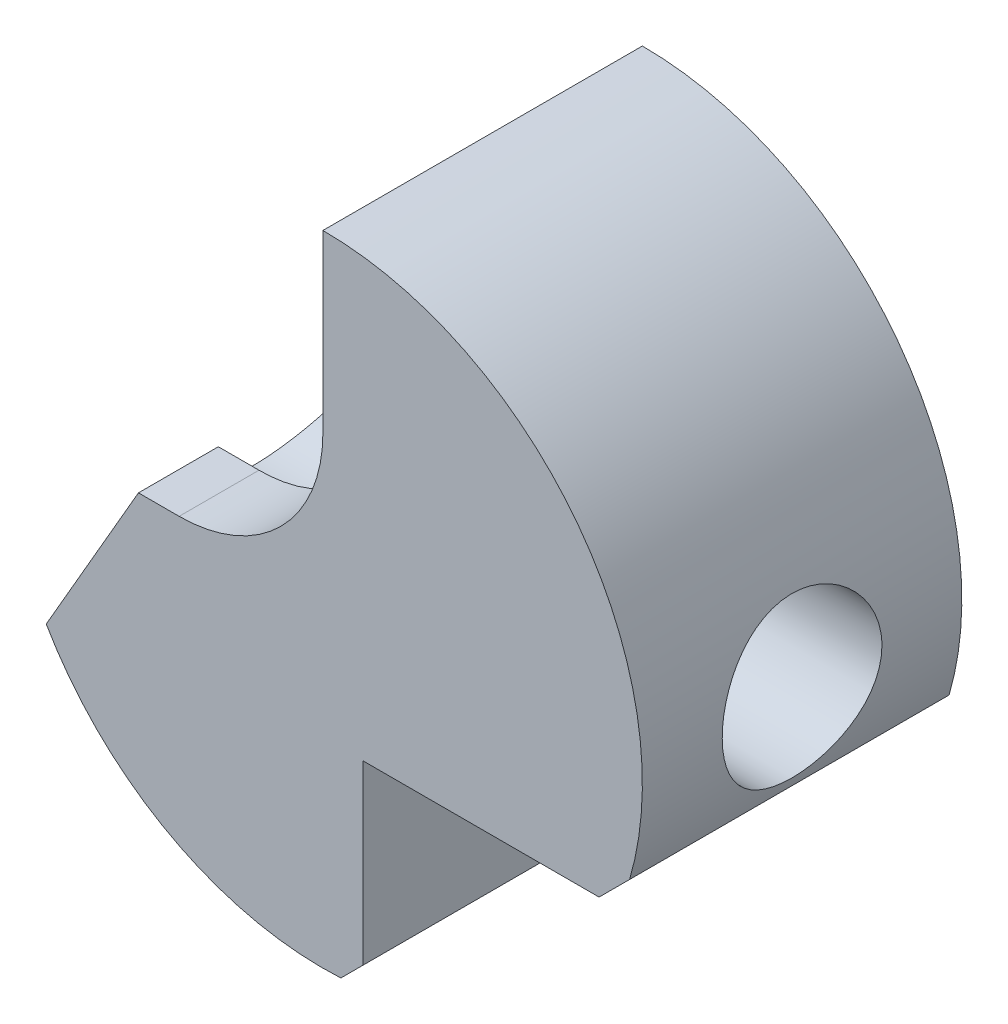
ISO-10303-21;
HEADER;
FILE_DESCRIPTION(('STEP AP214'),'2;1');
FILE_NAME('part.step','',(''),(''),'','','');
FILE_SCHEMA(('AUTOMOTIVE_DESIGN { 1 0 10303 214 1 1 1 1 }'));
ENDSEC;
DATA;
#1=APPLICATION_CONTEXT('core data for automotive mechanical design processes');
#2=APPLICATION_PROTOCOL_DEFINITION('international standard','automotive_design',2000,#1);
#3=PRODUCT_CONTEXT('',#1,'mechanical');
#4=PRODUCT('Part','Part','',(#3));
#5=PRODUCT_RELATED_PRODUCT_CATEGORY('part','',(#4));
#6=PRODUCT_DEFINITION_FORMATION('','',#4);
#7=PRODUCT_DEFINITION_CONTEXT('part definition',#1,'design');
#8=PRODUCT_DEFINITION('design','',#6,#7);
#9=PRODUCT_DEFINITION_SHAPE('','',#8);
#10=(LENGTH_UNIT() NAMED_UNIT(*) SI_UNIT(.MILLI.,.METRE.));
#11=(NAMED_UNIT(*) PLANE_ANGLE_UNIT() SI_UNIT($,.RADIAN.));
#12=(NAMED_UNIT(*) SI_UNIT($,.STERADIAN.) SOLID_ANGLE_UNIT());
#13=UNCERTAINTY_MEASURE_WITH_UNIT(LENGTH_MEASURE(1.E-05),#10,'distance_accuracy_value','');
#14=(GEOMETRIC_REPRESENTATION_CONTEXT(3) GLOBAL_UNCERTAINTY_ASSIGNED_CONTEXT((#13)) GLOBAL_UNIT_ASSIGNED_CONTEXT((#10,
#11,#12)) REPRESENTATION_CONTEXT('',''));
#15=CARTESIAN_POINT('',(0.,0.,0.));
#16=DIRECTION('',(0.,0.,1.));
#17=DIRECTION('',(1.,0.,0.));
#18=AXIS2_PLACEMENT_3D('',#15,#16,#17);
#19=CARTESIAN_POINT('',(0.,0.,10.));
#20=DIRECTION('',(0.,0.,-1.));
#21=DIRECTION('',(-1.,0.,0.));
#22=AXIS2_PLACEMENT_3D('',#19,#20,#21);
#23=CYLINDRICAL_SURFACE('',#22,20.);
#24=CARTESIAN_POINT('',(0.,0.,-10.));
#25=DIRECTION('',(0.,0.,1.));
#26=DIRECTION('',(1.,0.,0.));
#27=AXIS2_PLACEMENT_3D('',#24,#25,#26);
#28=CIRCLE('',#27,20.);
#29=CARTESIAN_POINT('',(-17.3205080756888,-9.99999999999996,-10.));
#30=VERTEX_POINT('',#29);
#31=CARTESIAN_POINT('',(1.1247886179115,-19.9683462150729,-10.));
#32=VERTEX_POINT('',#31);
#33=EDGE_CURVE('E200',#30,#32,#28,.T.);
#34=ORIENTED_EDGE('',*,*,#33,.T.);
#35=DIRECTION('',(0.,0.,-1.));
#36=VECTOR('',#35,1.);
#37=CARTESIAN_POINT('',(1.1247886179115,-19.9683462150729,10.));
#38=LINE('',#37,#36);
#39=CARTESIAN_POINT('',(1.1247886179115,-19.9683462150729,10.));
#40=VERTEX_POINT('',#39);
#41=EDGE_CURVE('E167',#32,#40,#38,.F.);
#42=ORIENTED_EDGE('',*,*,#41,.T.);
#43=CARTESIAN_POINT('',(0.,0.,10.));
#44=DIRECTION('',(0.,0.,1.));
#45=DIRECTION('',(1.,0.,0.));
#46=AXIS2_PLACEMENT_3D('',#43,#44,#45);
#47=CIRCLE('',#46,20.);
#48=CARTESIAN_POINT('',(-17.3205080756888,-9.99999999999996,10.));
#49=VERTEX_POINT('',#48);
#50=EDGE_CURVE('E199',#49,#40,#47,.T.);
#51=ORIENTED_EDGE('',*,*,#50,.F.);
#52=DIRECTION('',(0.,0.,-1.));
#53=VECTOR('',#52,1.);
#54=CARTESIAN_POINT('',(-17.3205080756888,-9.99999999999996,10.));
#55=LINE('',#54,#53);
#56=EDGE_CURVE('E247',#49,#30,#55,.T.);
#57=ORIENTED_EDGE('',*,*,#56,.T.);
#58=EDGE_LOOP('',(#34,#42,#51,#57));
#59=FACE_BOUND('',#58,.T.);
#60=ADVANCED_FACE('F41',(#59),#23,.T.);
#61=CARTESIAN_POINT('',(0.,0.,10.));
#62=DIRECTION('',(0.,0.,1.));
#63=DIRECTION('',(1.,0.,0.));
#64=AXIS2_PLACEMENT_3D('',#61,#62,#63);
#65=PLANE('',#64);
#66=DIRECTION('',(-1.,0.,0.));
#67=VECTOR('',#66,1.);
#68=CARTESIAN_POINT('',(0.,-7.5,10.));
#69=LINE('',#68,#67);
#70=CARTESIAN_POINT('',(17.2904962177391,-7.5,10.));
#71=VERTEX_POINT('',#70);
#72=CARTESIAN_POINT('',(2.5,-7.5,10.));
#73=VERTEX_POINT('',#72);
#74=EDGE_CURVE('E189',#71,#73,#69,.T.);
#75=ORIENTED_EDGE('',*,*,#74,.F.);
#76=DIRECTION('',(-0.70710678118655,-0.707106781186545,0.));
#77=VECTOR('',#76,1.);
#78=CARTESIAN_POINT('',(12.3952481088695,-12.3952481088696,10.));
#79=LINE('',#78,#77);
#80=CARTESIAN_POINT('',(19.203906149891,-5.58659006784818,10.));
#81=VERTEX_POINT('',#80);
#82=EDGE_CURVE('E56',#71,#81,#79,.F.);
#83=ORIENTED_EDGE('',*,*,#82,.T.);
#84=CARTESIAN_POINT('',(0.,20.,10.));
#85=VERTEX_POINT('',#84);
#86=EDGE_CURVE('E186',#81,#85,#47,.T.);
#87=ORIENTED_EDGE('',*,*,#86,.T.);
#88=DIRECTION('',(0.,-1.,0.));
#89=VECTOR('',#88,1.);
#90=CARTESIAN_POINT('',(0.,0.,10.));
#91=LINE('',#90,#89);
#92=CARTESIAN_POINT('',(0.,9.,10.));
#93=VERTEX_POINT('',#92);
#94=EDGE_CURVE('E243',#85,#93,#91,.T.);
#95=ORIENTED_EDGE('',*,*,#94,.T.);
#96=CARTESIAN_POINT('',(-9.,9.,10.));
#97=DIRECTION('',(0.,0.,1.));
#98=DIRECTION('',(1.,0.,0.));
#99=AXIS2_PLACEMENT_3D('',#96,#97,#98);
#100=CIRCLE('',#99,9.);
#101=CARTESIAN_POINT('',(-9.,0.,10.));
#102=VERTEX_POINT('',#101);
#103=EDGE_CURVE('E155',#93,#102,#100,.F.);
#104=ORIENTED_EDGE('',*,*,#103,.T.);
#105=DIRECTION('',(-1.,0.,0.));
#106=VECTOR('',#105,1.);
#107=CARTESIAN_POINT('',(0.,0.,10.));
#108=LINE('',#107,#106);
#109=CARTESIAN_POINT('',(-11.5470053837925,0.,10.));
#110=VERTEX_POINT('',#109);
#111=EDGE_CURVE('E241',#102,#110,#108,.T.);
#112=ORIENTED_EDGE('',*,*,#111,.T.);
#113=DIRECTION('',(0.500000000000001,0.866025403784438,0.));
#114=VECTOR('',#113,1.);
#115=CARTESIAN_POINT('',(-8.66025403784439,5.00000000000002,10.));
#116=LINE('',#115,#114);
#117=EDGE_CURVE('E230',#49,#110,#116,.T.);
#118=ORIENTED_EDGE('',*,*,#117,.F.);
#119=ORIENTED_EDGE('',*,*,#50,.T.);
#120=DIRECTION('',(0.707106781186548,0.707106781186547,0.));
#121=VECTOR('',#120,1.);
#122=CARTESIAN_POINT('',(10.5465674164922,-10.5465674164922,10.));
#123=LINE('',#122,#121);
#124=CARTESIAN_POINT('',(2.5,-18.5931348329844,10.));
#125=VERTEX_POINT('',#124);
#126=EDGE_CURVE('E170',#40,#125,#123,.T.);
#127=ORIENTED_EDGE('',*,*,#126,.T.);
#128=DIRECTION('',(0.,-1.,0.));
#129=VECTOR('',#128,1.);
#130=CARTESIAN_POINT('',(2.5,0.,10.));
#131=LINE('',#130,#129);
#132=EDGE_CURVE('E253',#73,#125,#131,.T.);
#133=ORIENTED_EDGE('',*,*,#132,.F.);
#134=EDGE_LOOP('',(#75,#83,#87,#95,#104,#112,#118,#119,#127,#133));
#135=FACE_BOUND('',#134,.T.);
#136=ADVANCED_FACE('F184',(#135),#65,.T.);
#137=CARTESIAN_POINT('',(-29.8594292563343,-31.7180485569795,-23.));
#138=DIRECTION('',(0.866025403784438,-0.500000000000001,0.));
#139=DIRECTION('',(0.500000000000001,0.866025403784438,0.));
#140=AXIS2_PLACEMENT_3D('',#137,#138,#139);
#141=PLANE('',#140);
#142=DIRECTION('',(0.,0.,1.));
#143=VECTOR('',#142,1.);
#144=CARTESIAN_POINT('',(-11.5470053837925,0.,-23.));
#145=LINE('',#144,#143);
#146=CARTESIAN_POINT('',(-11.5470053837925,0.,5.));
#147=VERTEX_POINT('',#146);
#148=EDGE_CURVE('E157',#147,#110,#145,.T.);
#149=ORIENTED_EDGE('',*,*,#148,.F.);
#150=CARTESIAN_POINT('',(-11.5470053837925,0.,0.));
#151=DIRECTION('',(0.866025403784438,-0.500000000000001,0.));
#152=DIRECTION('',(0.500000000000001,0.866025403784438,0.));
#153=AXIS2_PLACEMENT_3D('',#150,#151,#152);
#154=ELLIPSE('',#153,5.77350269189626,5.);
#155=CARTESIAN_POINT('',(-8.6602540378444,5.,0.));
#156=VERTEX_POINT('',#155);
#157=EDGE_CURVE('E147',#147,#156,#154,.T.);
#158=ORIENTED_EDGE('',*,*,#157,.T.);
#159=DIRECTION('',(-0.500000000000001,-0.866025403784438,0.));
#160=VECTOR('',#159,1.);
#161=CARTESIAN_POINT('',(-29.8594292563343,-31.7180485569795,0.));
#162=LINE('',#161,#160);
#163=CARTESIAN_POINT('',(0.,20.,0.));
#164=VERTEX_POINT('',#163);
#165=EDGE_CURVE('E146',#164,#156,#162,.T.);
#166=ORIENTED_EDGE('',*,*,#165,.F.);
#167=DIRECTION('',(0.,0.,1.));
#168=VECTOR('',#167,1.);
#169=CARTESIAN_POINT('',(0.,20.,-23.));
#170=LINE('',#169,#168);
#171=CARTESIAN_POINT('',(0.,20.,-10.));
#172=VERTEX_POINT('',#171);
#173=EDGE_CURVE('E248',#172,#164,#170,.T.);
#174=ORIENTED_EDGE('',*,*,#173,.F.);
#175=DIRECTION('',(0.500000000000001,0.866025403784438,0.));
#176=VECTOR('',#175,1.);
#177=CARTESIAN_POINT('',(-8.66025403784439,5.00000000000002,-10.));
#178=LINE('',#177,#176);
#179=EDGE_CURVE('E231',#30,#172,#178,.T.);
#180=ORIENTED_EDGE('',*,*,#179,.F.);
#181=ORIENTED_EDGE('',*,*,#56,.F.);
#182=ORIENTED_EDGE('',*,*,#117,.T.);
#183=EDGE_LOOP('',(#149,#158,#166,#174,#180,#181,#182));
#184=FACE_BOUND('',#183,.T.);
#185=ADVANCED_FACE('F246',(#184),#141,.F.);
#186=CARTESIAN_POINT('',(20.,0.,-5.));
#187=CARTESIAN_POINT('',(19.9999953289337,-0.276253628899104,-4.99999224753947));
#188=CARTESIAN_POINT('',(19.9942192710609,-0.552593859435877,-4.97702816408737));
#189=CARTESIAN_POINT('',(19.9717371276631,-1.09735441256844,-4.88591616230998));
#190=CARTESIAN_POINT('',(19.9550248473325,-1.3657701562358,-4.81774263487383));
#191=CARTESIAN_POINT('',(19.9125208777344,-1.88673624060859,-4.63853582179305));
#192=CARTESIAN_POINT('',(19.8867400947353,-2.13930521143334,-4.52755400428244));
#193=CARTESIAN_POINT('',(19.8288447935874,-2.62224043968143,-4.26606203318386));
#194=CARTESIAN_POINT('',(19.7967300618052,-2.85260594782921,-4.11555054627011));
#195=CARTESIAN_POINT('',(19.7289137863898,-3.28933975766972,-3.7759973678194));
#196=CARTESIAN_POINT('',(19.6931569049375,-3.49518563353686,-3.58629475013646));
#197=CARTESIAN_POINT('',(19.6224540039312,-3.87249642401106,-3.17515931696989));
#198=CARTESIAN_POINT('',(19.5875080763289,-4.0439574564973,-2.95372292351021));
#199=CARTESIAN_POINT('',(19.5218258566056,-4.35008847599658,-2.48134924421003));
#200=CARTESIAN_POINT('',(19.4911598154937,-4.4841740530838,-2.2300225639709));
#201=CARTESIAN_POINT('',(19.4383164939339,-4.70798969516915,-1.70750529446655));
#202=CARTESIAN_POINT('',(19.4161378564806,-4.79772685146714,-1.43631788889328));
#203=CARTESIAN_POINT('',(19.3833492232108,-4.92851612268255,-0.887521672661134));
#204=CARTESIAN_POINT('',(19.372516366567,-4.97050756110684,-0.610150346540026));
#205=CARTESIAN_POINT('',(19.362978748653,-5.00753925022136,-0.0521047700021815));
#206=CARTESIAN_POINT('',(19.3642720142643,-5.0025871393937,0.228568935640457));
#207=CARTESIAN_POINT('',(19.3786401838939,-4.94662174879902,0.778052692484511));
#208=CARTESIAN_POINT('',(19.3914287669098,-4.89672780063545,1.04698540488443));
#209=CARTESIAN_POINT('',(19.426890322369,-4.75408062300998,1.5725368363702));
#210=CARTESIAN_POINT('',(19.4495639989746,-4.66132434023131,1.82915467676307));
#211=CARTESIAN_POINT('',(19.5025037968553,-4.43463159312395,2.3257933875071));
#212=CARTESIAN_POINT('',(19.5328442489939,-4.3002888907764,2.5656205726319));
#213=CARTESIAN_POINT('',(19.5976570281997,-3.99452092004982,3.01972903252274));
#214=CARTESIAN_POINT('',(19.6321300778209,-3.82308916269612,3.23400582689084));
#215=CARTESIAN_POINT('',(19.7025293513297,-3.44221141560407,3.63734538564802));
#216=CARTESIAN_POINT('',(19.7384689826,-3.23182086055287,3.82551496687117));
#217=CARTESIAN_POINT('',(19.8068655192919,-2.78203972501233,4.16407080821301));
#218=CARTESIAN_POINT('',(19.8393223183136,-2.54264825902648,4.31445591421189));
#219=CARTESIAN_POINT('',(19.897257736473,-2.04038629560464,4.57350195408129));
#220=CARTESIAN_POINT('',(19.9227120042576,-1.77743797736208,4.68201780084809));
#221=CARTESIAN_POINT('',(19.9635972330472,-1.23625336047628,4.85305768569858));
#222=CARTESIAN_POINT('',(19.9790301113094,-0.958019997168281,4.91559052139379));
#223=CARTESIAN_POINT('',(19.9978499757125,-0.401799901300088,4.99152521852946));
#224=CARTESIAN_POINT('',(20.0015351169426,-0.123989066627364,5.00614342025101));
#225=CARTESIAN_POINT('',(19.9972934938151,0.430109582671697,4.98916999314837));
#226=CARTESIAN_POINT('',(19.9893677747284,0.706397532148656,4.95758252400288));
#227=CARTESIAN_POINT('',(19.9629860375783,1.24538089592164,4.85009697202875));
#228=CARTESIAN_POINT('',(19.9446878061929,1.50821706322917,4.77486245507675));
#229=CARTESIAN_POINT('',(19.899623554472,2.01752430817505,4.5829763865718));
#230=CARTESIAN_POINT('',(19.8728566789995,2.26399373010884,4.46632065228926));
#231=CARTESIAN_POINT('',(19.8131102642072,2.73841044809943,4.19254623708441));
#232=CARTESIAN_POINT('',(19.7800289122193,2.96595147278588,4.03474629201144));
#233=CARTESIAN_POINT('',(19.7114836395924,3.39175537881104,3.68403363734278));
#234=CARTESIAN_POINT('',(19.676019308434,3.59001319657751,3.49111486794122));
#235=CARTESIAN_POINT('',(19.6056318986475,3.95663522690827,3.06999346385426));
#236=CARTESIAN_POINT('',(19.57074347274,4.12414622540362,2.84104099000128));
#237=CARTESIAN_POINT('',(19.5064292794107,4.41836919671214,2.35755788510492));
#238=CARTESIAN_POINT('',(19.4770032695336,4.54508298053823,2.10302839009921));
#239=CARTESIAN_POINT('',(19.4272698238587,4.75317140202426,1.57698092531186));
#240=CARTESIAN_POINT('',(19.4069085073875,4.83481465547784,1.30557457228981));
#241=CARTESIAN_POINT('',(19.3775581342603,4.95115219981056,0.752301207151547));
#242=CARTESIAN_POINT('',(19.3685665905607,4.98585675825595,0.470436496604616));
#243=CARTESIAN_POINT('',(19.3631633735661,5.00679530111928,-0.0870700795596853));
#244=CARTESIAN_POINT('',(19.366397756045,4.99439299259115,-0.362658117145653));
#245=CARTESIAN_POINT('',(19.3842636317313,4.92459092769654,-0.907679628938991));
#246=CARTESIAN_POINT('',(19.3988948958968,4.86719207562106,-1.17711322671953));
#247=CARTESIAN_POINT('',(19.4377086899188,4.70977106481402,-1.70069486353336));
#248=CARTESIAN_POINT('',(19.461833841343,4.61000468226918,-1.95492435079587));
#249=CARTESIAN_POINT('',(19.5169251906949,4.37088304534897,-2.4432179423838));
#250=CARTESIAN_POINT('',(19.5478923373231,4.23152230011362,-2.6772792439577));
#251=CARTESIAN_POINT('',(19.6141878088207,3.91289249545747,-3.12518209667206));
#252=CARTESIAN_POINT('',(19.6496088277351,3.73267720970761,-3.33833691141284));
#253=CARTESIAN_POINT('',(19.7202675748663,3.33929790396569,-3.73182348265172));
#254=CARTESIAN_POINT('',(19.755505257566,3.12612607087046,-3.91214743370999));
#255=CARTESIAN_POINT('',(19.8225885215915,2.66822528900866,-4.23803769521526));
#256=CARTESIAN_POINT('',(19.8543611121963,2.42299474105463,-4.38291537890524));
#257=CARTESIAN_POINT('',(19.9101641658366,1.91088686503491,-4.62915820980179));
#258=CARTESIAN_POINT('',(19.9342001733259,1.64402521145579,-4.73055453549513));
#259=CARTESIAN_POINT('',(19.9682686521849,1.14803417747824,-4.87190610109884));
#260=CARTESIAN_POINT('',(19.9800861684231,0.921267236360227,-4.91983747684478));
#261=CARTESIAN_POINT('',(19.9959535077316,0.463020238454276,-4.98388647873981));
#262=CARTESIAN_POINT('',(20.0000039150298,0.231540537475387,-5.00000649768434));
#263=CARTESIAN_POINT('',(20.,0.,-5.));
#264=B_SPLINE_CURVE_WITH_KNOTS('',3,(#186,#187,#188,#189,#190,#191,#192,#193,#194,#195,#196,
#197,#198,#199,#200,#201,#202,#203,#204,#205,#206,#207,#208,#209,#210,#211,#212,#213,#214,#215,
#216,#217,#218,#219,#220,#221,#222,#223,#224,#225,#226,#227,#228,#229,#230,#231,#232,#233,#234,
#235,#236,#237,#238,#239,#240,#241,#242,#243,#244,#245,#246,#247,#248,#249,#250,#251,#252,#253,
#254,#255,#256,#257,#258,#259,#260,#261,#262,#263),.UNSPECIFIED.,.T.,.F.,(4,2,2,2,2,2,2,2,2,2,2,
2,2,2,2,2,2,2,2,2,2,2,2,2,2,2,2,2,2,2,2,2,2,2,2,2,2,2,4),(0.,0.827912374906299,1.65629412587967,
2.48368300762035,3.31109980056443,4.1538145145713,4.9966243193354,5.85195491819356,
6.70714870564561,7.54520983670233,8.38313460386725,9.20074990034463,10.0184234489786,
10.84435092924,11.6704230279828,12.5200500324113,13.3697029853856,14.2222743004145,
15.0746824563988,15.9052769650866,16.7357967038688,17.5540091505786,18.372304244187,
19.2051195856224,20.0380787670447,20.8914836402599,21.7448506250943,22.5930751539527,
23.4411141086095,24.2647926801851,25.0884546987996,25.9072133522467,26.7260856048285,
27.5663192139288,28.4067523259457,29.2624061835847,30.1174454609768,30.8114080983367,
31.5053185350331),.UNSPECIFIED.);
#265=CARTESIAN_POINT('',(20.,0.,-5.));
#266=VERTEX_POINT('',#265);
#267=EDGE_CURVE('E213',#266,#266,#264,.T.);
#268=ORIENTED_EDGE('',*,*,#267,.T.);
#269=EDGE_LOOP('',(#268));
#270=FACE_BOUND('',#269,.T.);
#271=ORIENTED_EDGE('',*,*,#86,.F.);
#272=DIRECTION('',(0.,0.,-1.));
#273=VECTOR('',#272,1.);
#274=CARTESIAN_POINT('',(19.203906149891,-5.58659006784818,10.));
#275=LINE('',#274,#273);
#276=CARTESIAN_POINT('',(19.203906149891,-5.58659006784818,-10.));
#277=VERTEX_POINT('',#276);
#278=EDGE_CURVE('E176',#81,#277,#275,.T.);
#279=ORIENTED_EDGE('',*,*,#278,.T.);
#280=EDGE_CURVE('E206',#277,#172,#28,.T.);
#281=ORIENTED_EDGE('',*,*,#280,.T.);
#282=ORIENTED_EDGE('',*,*,#173,.T.);
#283=EDGE_CURVE('E198',#164,#85,#170,.T.);
#284=ORIENTED_EDGE('',*,*,#283,.T.);
#285=EDGE_LOOP('',(#271,#279,#281,#282,#284));
#286=FACE_BOUND('',#285,.T.);
#287=ADVANCED_FACE('F194',(#270,#286),#23,.T.);
#288=CARTESIAN_POINT('',(0.,0.,-10.));
#289=DIRECTION('',(0.,0.,1.));
#290=DIRECTION('',(1.,0.,0.));
#291=AXIS2_PLACEMENT_3D('',#288,#289,#290);
#292=PLANE('',#291);
#293=ORIENTED_EDGE('',*,*,#280,.F.);
#294=DIRECTION('',(0.70710678118655,0.707106781186545,0.));
#295=VECTOR('',#294,1.);
#296=CARTESIAN_POINT('',(19.203906149891,-5.58659006784818,-10.));
#297=LINE('',#296,#295);
#298=CARTESIAN_POINT('',(17.2904962177391,-7.5,-10.));
#299=VERTEX_POINT('',#298);
#300=EDGE_CURVE('E179',#277,#299,#297,.F.);
#301=ORIENTED_EDGE('',*,*,#300,.T.);
#302=DIRECTION('',(-1.,0.,0.));
#303=VECTOR('',#302,1.);
#304=CARTESIAN_POINT('',(0.,-7.5,-10.));
#305=LINE('',#304,#303);
#306=CARTESIAN_POINT('',(2.5,-7.5,-10.));
#307=VERTEX_POINT('',#306);
#308=EDGE_CURVE('E162',#299,#307,#305,.T.);
#309=ORIENTED_EDGE('',*,*,#308,.T.);
#310=DIRECTION('',(0.,-1.,0.));
#311=VECTOR('',#310,1.);
#312=CARTESIAN_POINT('',(2.5,0.,-10.));
#313=LINE('',#312,#311);
#314=CARTESIAN_POINT('',(2.5,-18.5931348329844,-10.));
#315=VERTEX_POINT('',#314);
#316=EDGE_CURVE('E164',#307,#315,#313,.T.);
#317=ORIENTED_EDGE('',*,*,#316,.T.);
#318=DIRECTION('',(-0.707106781186548,-0.707106781186547,0.));
#319=VECTOR('',#318,1.);
#320=CARTESIAN_POINT('',(1.1247886179115,-19.9683462150729,-10.));
#321=LINE('',#320,#319);
#322=EDGE_CURVE('E174',#315,#32,#321,.T.);
#323=ORIENTED_EDGE('',*,*,#322,.T.);
#324=ORIENTED_EDGE('',*,*,#33,.F.);
#325=ORIENTED_EDGE('',*,*,#179,.T.);
#326=EDGE_LOOP('',(#293,#301,#309,#317,#323,#324,#325));
#327=FACE_BOUND('',#326,.T.);
#328=ADVANCED_FACE('F203',(#327),#292,.F.);
#329=CARTESIAN_POINT('',(0.,0.,0.));
#330=DIRECTION('',(0.,0.,1.));
#331=DIRECTION('',(1.,0.,0.));
#332=AXIS2_PLACEMENT_3D('',#329,#330,#331);
#333=PLANE('',#332);
#334=DIRECTION('',(1.,0.,0.));
#335=VECTOR('',#334,1.);
#336=CARTESIAN_POINT('',(-33.,5.,0.));
#337=LINE('',#336,#335);
#338=CARTESIAN_POINT('',(-0.937742251701451,5.,0.));
#339=VERTEX_POINT('',#338);
#340=EDGE_CURVE('E134',#339,#156,#337,.F.);
#341=ORIENTED_EDGE('',*,*,#340,.F.);
#342=CARTESIAN_POINT('',(-9.,9.,0.));
#343=DIRECTION('',(0.,0.,1.));
#344=DIRECTION('',(1.,0.,0.));
#345=AXIS2_PLACEMENT_3D('',#342,#343,#344);
#346=CIRCLE('',#345,9.);
#347=CARTESIAN_POINT('',(0.,9.,0.));
#348=VERTEX_POINT('',#347);
#349=EDGE_CURVE('E143',#339,#348,#346,.T.);
#350=ORIENTED_EDGE('',*,*,#349,.T.);
#351=DIRECTION('',(0.,1.,0.));
#352=VECTOR('',#351,1.);
#353=CARTESIAN_POINT('',(0.,0.,0.));
#354=LINE('',#353,#352);
#355=EDGE_CURVE('E244',#348,#164,#354,.T.);
#356=ORIENTED_EDGE('',*,*,#355,.T.);
#357=ORIENTED_EDGE('',*,*,#165,.T.);
#358=EDGE_LOOP('',(#341,#350,#356,#357));
#359=FACE_BOUND('',#358,.T.);
#360=ADVANCED_FACE('F142',(#359),#333,.T.);
#361=CARTESIAN_POINT('',(0.,0.,66.));
#362=DIRECTION('',(-1.,0.,0.));
#363=DIRECTION('',(0.,0.,1.));
#364=AXIS2_PLACEMENT_3D('',#361,#362,#363);
#365=PLANE('',#364);
#366=ORIENTED_EDGE('',*,*,#355,.F.);
#367=DIRECTION('',(0.,0.,-1.));
#368=VECTOR('',#367,1.);
#369=CARTESIAN_POINT('',(0.,9.,10.));
#370=LINE('',#369,#368);
#371=EDGE_CURVE('E152',#348,#93,#370,.F.);
#372=ORIENTED_EDGE('',*,*,#371,.T.);
#373=ORIENTED_EDGE('',*,*,#94,.F.);
#374=ORIENTED_EDGE('',*,*,#283,.F.);
#375=EDGE_LOOP('',(#366,#372,#373,#374));
#376=FACE_BOUND('',#375,.T.);
#377=ADVANCED_FACE('F274',(#376),#365,.T.);
#378=CARTESIAN_POINT('',(0.,0.,66.));
#379=DIRECTION('',(0.,1.,0.));
#380=DIRECTION('',(0.,0.,1.));
#381=AXIS2_PLACEMENT_3D('',#378,#379,#380);
#382=PLANE('',#381);
#383=DIRECTION('',(1.,0.,0.));
#384=VECTOR('',#383,1.);
#385=CARTESIAN_POINT('',(-33.,0.,5.));
#386=LINE('',#385,#384);
#387=CARTESIAN_POINT('',(-9.,0.,5.));
#388=VERTEX_POINT('',#387);
#389=EDGE_CURVE('E63',#147,#388,#386,.T.);
#390=ORIENTED_EDGE('',*,*,#389,.F.);
#391=ORIENTED_EDGE('',*,*,#148,.T.);
#392=ORIENTED_EDGE('',*,*,#111,.F.);
#393=DIRECTION('',(0.,0.,-1.));
#394=VECTOR('',#393,1.);
#395=CARTESIAN_POINT('',(-9.,0.,0.));
#396=LINE('',#395,#394);
#397=EDGE_CURVE('E153',#102,#388,#396,.T.);
#398=ORIENTED_EDGE('',*,*,#397,.T.);
#399=EDGE_LOOP('',(#390,#391,#392,#398));
#400=FACE_BOUND('',#399,.T.);
#401=ADVANCED_FACE('F240',(#400),#382,.T.);
#402=CARTESIAN_POINT('',(-9.,9.,66.));
#403=DIRECTION('',(0.,0.,1.));
#404=DIRECTION('',(1.,0.,0.));
#405=AXIS2_PLACEMENT_3D('',#402,#403,#404);
#406=CYLINDRICAL_SURFACE('',#405,9.);
#407=ORIENTED_EDGE('',*,*,#349,.F.);
#408=CARTESIAN_POINT('',(-0.937742251701451,5.,0.));
#409=CARTESIAN_POINT('',(-0.937754611603695,5.00001938165649,0.12551041695247));
#410=CARTESIAN_POINT('',(-0.940087241152037,4.99527494334288,0.251019989196207));
#411=CARTESIAN_POINT('',(-0.949483041664537,4.97639681472261,0.50115176671317));
#412=CARTESIAN_POINT('',(-0.956546169183402,4.96226321064685,0.625773980125351));
#413=CARTESIAN_POINT('',(-0.975487876973385,4.92475520830228,0.873181247162677));
#414=CARTESIAN_POINT('',(-0.987363869059027,4.90138577689649,0.995967251493931));
#415=CARTESIAN_POINT('',(-1.01609993377851,4.84568567031219,1.23889252112268));
#416=CARTESIAN_POINT('',(-1.03295988837694,4.81335520735935,1.35903184902915));
#417=CARTESIAN_POINT('',(-1.07189180032909,4.74009164017036,1.59590526414193));
#418=CARTESIAN_POINT('',(-1.09396810460969,4.69915136428782,1.71263641957539));
#419=CARTESIAN_POINT('',(-1.14356786256593,4.609201633021,1.94175333488256));
#420=CARTESIAN_POINT('',(-1.17109135979946,4.56019211311242,2.05413905999993));
#421=CARTESIAN_POINT('',(-1.23181570756361,4.45478189609602,2.27370608728995));
#422=CARTESIAN_POINT('',(-1.26501315208776,4.39838563788199,2.38089046250054));
#423=CARTESIAN_POINT('',(-1.337325292069,4.27895279939292,2.58940104253263));
#424=CARTESIAN_POINT('',(-1.37643991738747,4.21591629782992,2.69072731677277));
#425=CARTESIAN_POINT('',(-1.46056531488765,4.08441412801755,2.88641488556182));
#426=CARTESIAN_POINT('',(-1.50554656964088,4.01597627500612,2.98080757780862));
#427=CARTESIAN_POINT('',(-1.60168319719233,3.87435534352692,3.16269850197731));
#428=CARTESIAN_POINT('',(-1.65284101333521,3.80117039251895,3.25019398270559));
#429=CARTESIAN_POINT('',(-1.76134255829766,3.65113037407803,3.41788019835227));
#430=CARTESIAN_POINT('',(-1.81868592882402,3.57427551936483,3.49807135587188));
#431=CARTESIAN_POINT('',(-1.93950139482989,3.41796486775009,3.65095475756501));
#432=CARTESIAN_POINT('',(-2.00297397141286,3.33850886699931,3.72364641214771));
#433=CARTESIAN_POINT('',(-2.13796115527067,3.17557231203588,3.86362960042922));
#434=CARTESIAN_POINT('',(-2.20966462279916,3.09204347733282,3.93068253202623));
#435=CARTESIAN_POINT('',(-2.35915934921883,2.92448830575477,4.05689189980585));
#436=CARTESIAN_POINT('',(-2.43695059716076,2.84046196977481,4.11604835019024));
#437=CARTESIAN_POINT('',(-2.5983040354633,2.6729301017853,4.2267633980107));
#438=CARTESIAN_POINT('',(-2.68186708794613,2.58942464961891,4.27832085678151));
#439=CARTESIAN_POINT('',(-2.85438094288559,2.42385571622908,4.37425216958985));
#440=CARTESIAN_POINT('',(-2.94333278937102,2.34179251842777,4.41862462544422));
#441=CARTESIAN_POINT('',(-3.16542064587861,2.14521488613616,4.51828072327643));
#442=CARTESIAN_POINT('',(-3.30115706551316,2.03186273467124,4.57009260407144));
#443=CARTESIAN_POINT('',(-3.58160689963769,1.81161710776372,4.6617903416727));
#444=CARTESIAN_POINT('',(-3.72632348219858,1.70472593821689,4.70167196044169));
#445=CARTESIAN_POINT('',(-4.02388894566981,1.49859014669719,4.77138278060432));
#446=CARTESIAN_POINT('',(-4.17675526329636,1.3993631312537,4.8011893376019));
#447=CARTESIAN_POINT('',(-4.48924359872313,1.20984667601817,4.85241227949707));
#448=CARTESIAN_POINT('',(-4.64886567518897,1.11955731386165,4.87382859151889));
#449=CARTESIAN_POINT('',(-5.02210123931998,0.9233077905196,4.91531753931951));
#450=CARTESIAN_POINT('',(-5.23769987806189,0.820629989798908,4.93311227862542));
#451=CARTESIAN_POINT('',(-5.67684303178393,0.632578845246276,4.96073348965536));
#452=CARTESIAN_POINT('',(-5.90039034503231,0.547211667812555,4.97055712563641));
#453=CARTESIAN_POINT('',(-6.3536282586334,0.394544055422135,4.98499891893876));
#454=CARTESIAN_POINT('',(-6.58331643669995,0.32723660906751,4.98961909865159));
#455=CARTESIAN_POINT('',(-7.04725263868068,0.211146243860961,4.99587757936197));
#456=CARTESIAN_POINT('',(-7.28149885833515,0.162356145826491,4.9975170369229));
#457=CARTESIAN_POINT('',(-7.76250880885728,0.0820194782287072,4.9994967313086));
#458=CARTESIAN_POINT('',(-8.00940101073043,0.051231867168992,4.99978297486513));
#459=CARTESIAN_POINT('',(-8.38061811996026,0.0204818268498243,4.99996684851729));
#460=CARTESIAN_POINT('',(-8.50434956504129,0.0128037100568737,4.99998735055941));
#461=CARTESIAN_POINT('',(-8.7520489764378,0.00256238014000665,5.00000084337105));
#462=CARTESIAN_POINT('',(-8.87601698543355,1.99215419578049E-07,4.99999382858958));
#463=CARTESIAN_POINT('',(-9.,0.,5.));
#464=B_SPLINE_CURVE_WITH_KNOTS('',3,(#408,#409,#410,#411,#412,#413,#414,#415,#416,#417,#418,
#419,#420,#421,#422,#423,#424,#425,#426,#427,#428,#429,#430,#431,#432,#433,#434,#435,#436,#437,
#438,#439,#440,#441,#442,#443,#444,#445,#446,#447,#448,#449,#450,#451,#452,#453,#454,#455,#456,
#457,#458,#459,#460,#461,#462,#463),.UNSPECIFIED.,.F.,.F.,(4,2,2,2,2,2,2,2,2,2,2,2,2,2,2,2,2,2,
2,2,2,2,2,2,2,2,2,4),(0.,0.376418976303569,0.752834495590744,1.12904786018894,1.50525231562179,
1.88177138509079,2.25829346547493,2.63459031268276,3.01088269984934,3.38535000643265,
3.75996593439737,4.13456017468038,4.50918384215277,4.89547152710903,5.28175851731913,
5.66810333169777,6.05452323766942,6.60652233446655,7.15871728800554,7.71214521119949,
8.26557794123593,8.98297497053028,9.70062710412771,10.4180002164487,11.1350949181531,
11.8805731193654,12.252390711631,12.624283314826),.UNSPECIFIED.);
#465=EDGE_CURVE('E11',#339,#388,#464,.T.);
#466=ORIENTED_EDGE('',*,*,#465,.T.);
#467=ORIENTED_EDGE('',*,*,#397,.F.);
#468=ORIENTED_EDGE('',*,*,#103,.F.);
#469=ORIENTED_EDGE('',*,*,#371,.F.);
#470=EDGE_LOOP('',(#407,#466,#467,#468,#469));
#471=FACE_BOUND('',#470,.T.);
#472=ADVANCED_FACE('F150',(#471),#406,.F.);
#473=CARTESIAN_POINT('',(2.5,-7.5,-33.));
#474=DIRECTION('',(-1.,0.,0.));
#475=DIRECTION('',(0.,-1.,0.));
#476=AXIS2_PLACEMENT_3D('',#473,#474,#475);
#477=PLANE('',#476);
#478=ORIENTED_EDGE('',*,*,#132,.T.);
#479=DIRECTION('',(0.,0.,-1.));
#480=VECTOR('',#479,1.);
#481=CARTESIAN_POINT('',(2.5,-18.5931348329844,-33.));
#482=LINE('',#481,#480);
#483=EDGE_CURVE('E172',#125,#315,#482,.T.);
#484=ORIENTED_EDGE('',*,*,#483,.T.);
#485=ORIENTED_EDGE('',*,*,#316,.F.);
#486=DIRECTION('',(0.,0.,1.));
#487=VECTOR('',#486,1.);
#488=CARTESIAN_POINT('',(2.5,-7.5,-33.));
#489=LINE('',#488,#487);
#490=EDGE_CURVE('E209',#307,#73,#489,.T.);
#491=ORIENTED_EDGE('',*,*,#490,.T.);
#492=EDGE_LOOP('',(#478,#484,#485,#491));
#493=FACE_BOUND('',#492,.T.);
#494=ADVANCED_FACE('F215',(#493),#477,.F.);
#495=CARTESIAN_POINT('',(2.5,-7.5,-33.));
#496=DIRECTION('',(0.,1.,0.));
#497=DIRECTION('',(0.,0.,1.));
#498=AXIS2_PLACEMENT_3D('',#495,#496,#497);
#499=PLANE('',#498);
#500=ORIENTED_EDGE('',*,*,#308,.F.);
#501=DIRECTION('',(0.,0.,1.));
#502=VECTOR('',#501,1.);
#503=CARTESIAN_POINT('',(17.2904962177391,-7.5,-33.));
#504=LINE('',#503,#502);
#505=EDGE_CURVE('E70',#299,#71,#504,.T.);
#506=ORIENTED_EDGE('',*,*,#505,.T.);
#507=ORIENTED_EDGE('',*,*,#74,.T.);
#508=ORIENTED_EDGE('',*,*,#490,.F.);
#509=EDGE_LOOP('',(#500,#506,#507,#508));
#510=FACE_BOUND('',#509,.T.);
#511=ADVANCED_FACE('F207',(#510),#499,.F.);
#512=CARTESIAN_POINT('',(1.1247886179115,-19.9683462150729,10.));
#513=DIRECTION('',(0.707106781186547,-0.707106781186548,0.));
#514=DIRECTION('',(0.,0.,-1.));
#515=AXIS2_PLACEMENT_3D('',#512,#513,#514);
#516=PLANE('',#515);
#517=ORIENTED_EDGE('',*,*,#322,.F.);
#518=ORIENTED_EDGE('',*,*,#483,.F.);
#519=ORIENTED_EDGE('',*,*,#126,.F.);
#520=ORIENTED_EDGE('',*,*,#41,.F.);
#521=EDGE_LOOP('',(#517,#518,#519,#520));
#522=FACE_BOUND('',#521,.T.);
#523=ADVANCED_FACE('F222',(#522),#516,.T.);
#524=CARTESIAN_POINT('',(19.203906149891,-5.58659006784818,10.));
#525=DIRECTION('',(-0.707106781186545,0.70710678118655,0.));
#526=DIRECTION('',(0.,0.,-1.));
#527=AXIS2_PLACEMENT_3D('',#524,#525,#526);
#528=PLANE('',#527);
#529=ORIENTED_EDGE('',*,*,#82,.F.);
#530=ORIENTED_EDGE('',*,*,#505,.F.);
#531=ORIENTED_EDGE('',*,*,#300,.F.);
#532=ORIENTED_EDGE('',*,*,#278,.F.);
#533=EDGE_LOOP('',(#529,#530,#531,#532));
#534=FACE_BOUND('',#533,.T.);
#535=ADVANCED_FACE('F44',(#534),#528,.F.);
#536=CARTESIAN_POINT('',(-33.,0.,0.));
#537=DIRECTION('',(1.,0.,0.));
#538=DIRECTION('',(0.,0.,-1.));
#539=AXIS2_PLACEMENT_3D('',#536,#537,#538);
#540=CYLINDRICAL_SURFACE('',#539,5.);
#541=ORIENTED_EDGE('',*,*,#389,.T.);
#542=ORIENTED_EDGE('',*,*,#465,.F.);
#543=ORIENTED_EDGE('',*,*,#340,.T.);
#544=ORIENTED_EDGE('',*,*,#157,.F.);
#545=EDGE_LOOP('',(#541,#542,#543,#544));
#546=FACE_BOUND('',#545,.T.);
#547=ORIENTED_EDGE('',*,*,#267,.F.);
#548=EDGE_LOOP('',(#547));
#549=FACE_BOUND('',#548,.T.);
#550=ADVANCED_FACE('F132',(#546,#549),#540,.F.);
#551=CLOSED_SHELL('',(#60,#136,#185,#287,#328,#360,#377,#401,#472,#494,#511,#523,#535,#550));
#552=MANIFOLD_SOLID_BREP('B2',#551);
#553=ADVANCED_BREP_SHAPE_REPRESENTATION('',(#18,#552),#14);
#554=SHAPE_DEFINITION_REPRESENTATION(#9,#553);
ENDSEC;
END-ISO-10303-21;
